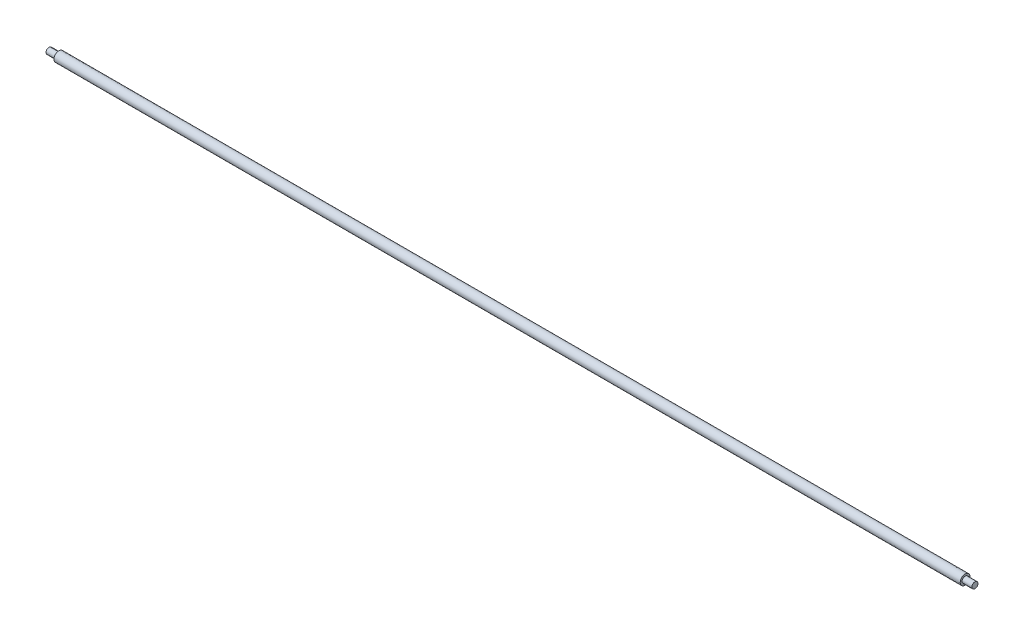
ISO-10303-21;
HEADER;
FILE_DESCRIPTION(('STEP AP214'),'2;1');
FILE_NAME('part.step','',(''),(''),'','','');
FILE_SCHEMA(('AUTOMOTIVE_DESIGN { 1 0 10303 214 1 1 1 1 }'));
ENDSEC;
DATA;
#1=APPLICATION_CONTEXT('core data for automotive mechanical design processes');
#2=APPLICATION_PROTOCOL_DEFINITION('international standard','automotive_design',2000,#1);
#3=PRODUCT_CONTEXT('',#1,'mechanical');
#4=PRODUCT('Part','Part','',(#3));
#5=PRODUCT_RELATED_PRODUCT_CATEGORY('part','',(#4));
#6=PRODUCT_DEFINITION_FORMATION('','',#4);
#7=PRODUCT_DEFINITION_CONTEXT('part definition',#1,'design');
#8=PRODUCT_DEFINITION('design','',#6,#7);
#9=PRODUCT_DEFINITION_SHAPE('','',#8);
#10=(LENGTH_UNIT() NAMED_UNIT(*) SI_UNIT(.MILLI.,.METRE.));
#11=(NAMED_UNIT(*) PLANE_ANGLE_UNIT() SI_UNIT($,.RADIAN.));
#12=(NAMED_UNIT(*) SI_UNIT($,.STERADIAN.) SOLID_ANGLE_UNIT());
#13=UNCERTAINTY_MEASURE_WITH_UNIT(LENGTH_MEASURE(1.E-05),#10,'distance_accuracy_value','');
#14=(GEOMETRIC_REPRESENTATION_CONTEXT(3) GLOBAL_UNCERTAINTY_ASSIGNED_CONTEXT((#13)) GLOBAL_UNIT_ASSIGNED_CONTEXT((#10,
#11,#12)) REPRESENTATION_CONTEXT('',''));
#15=CARTESIAN_POINT('',(0.,0.,0.));
#16=DIRECTION('',(0.,0.,1.));
#17=DIRECTION('',(1.,0.,0.));
#18=AXIS2_PLACEMENT_3D('',#15,#16,#17);
#19=CARTESIAN_POINT('',(155.702,0.,0.));
#20=DIRECTION('',(-1.,0.,0.));
#21=DIRECTION('',(0.,0.,1.));
#22=AXIS2_PLACEMENT_3D('',#19,#20,#21);
#23=CYLINDRICAL_SURFACE('',#22,1.02616);
#24=CARTESIAN_POINT('',(155.702,0.,0.));
#25=DIRECTION('',(1.,0.,0.));
#26=DIRECTION('',(0.,0.,-1.));
#27=AXIS2_PLACEMENT_3D('',#24,#25,#26);
#28=CIRCLE('',#27,1.02616);
#29=CARTESIAN_POINT('',(155.702,0.,-1.02616));
#30=VERTEX_POINT('',#29);
#31=EDGE_CURVE('E11',#30,#30,#28,.T.);
#32=ORIENTED_EDGE('',*,*,#31,.F.);
#33=EDGE_LOOP('',(#32));
#34=FACE_BOUND('',#33,.T.);
#35=CARTESIAN_POINT('',(-155.702,0.,0.));
#36=DIRECTION('',(1.,0.,0.));
#37=DIRECTION('',(0.,0.,-1.));
#38=AXIS2_PLACEMENT_3D('',#35,#36,#37);
#39=CIRCLE('',#38,1.02616);
#40=CARTESIAN_POINT('',(-155.702,0.,-1.02616));
#41=VERTEX_POINT('',#40);
#42=EDGE_CURVE('E46',#41,#41,#39,.T.);
#43=ORIENTED_EDGE('',*,*,#42,.T.);
#44=EDGE_LOOP('',(#43));
#45=FACE_BOUND('',#44,.T.);
#46=ADVANCED_FACE('F40',(#34,#45),#23,.T.);
#47=CARTESIAN_POINT('',(155.702,0.,0.));
#48=DIRECTION('',(1.,0.,0.));
#49=DIRECTION('',(0.,0.,-1.));
#50=AXIS2_PLACEMENT_3D('',#47,#48,#49);
#51=PLANE('',#50);
#52=ORIENTED_EDGE('',*,*,#31,.T.);
#53=EDGE_LOOP('',(#52));
#54=FACE_BOUND('',#53,.T.);
#55=ADVANCED_FACE('F55',(#54),#51,.T.);
#56=CARTESIAN_POINT('',(-155.702,0.,0.));
#57=DIRECTION('',(1.,0.,0.));
#58=DIRECTION('',(0.,0.,-1.));
#59=AXIS2_PLACEMENT_3D('',#56,#57,#58);
#60=PLANE('',#59);
#61=ORIENTED_EDGE('',*,*,#42,.F.);
#62=EDGE_LOOP('',(#61));
#63=FACE_BOUND('',#62,.T.);
#64=ADVANCED_FACE('F53',(#63),#60,.F.);
#65=CLOSED_SHELL('',(#46,#55,#64));
#66=MANIFOLD_SOLID_BREP('B2',#65);
#67=CARTESIAN_POINT('',(-152.4,0.,0.));
#68=DIRECTION('',(1.,0.,0.));
#69=DIRECTION('',(0.,0.,-1.));
#70=AXIS2_PLACEMENT_3D('',#67,#68,#69);
#71=CYLINDRICAL_SURFACE('',#70,1.651);
#72=CARTESIAN_POINT('',(-152.4,0.,0.));
#73=DIRECTION('',(1.,0.,0.));
#74=DIRECTION('',(0.,0.,-1.));
#75=AXIS2_PLACEMENT_3D('',#72,#73,#74);
#76=CIRCLE('',#75,1.651);
#77=CARTESIAN_POINT('',(-152.4,0.,-1.651));
#78=VERTEX_POINT('',#77);
#79=EDGE_CURVE('E39',#78,#78,#76,.T.);
#80=CARTESIAN_POINT('',(152.4,0.,0.));
#81=DIRECTION('',(1.,0.,0.));
#82=DIRECTION('',(0.,0.,-1.));
#83=AXIS2_PLACEMENT_3D('',#80,#81,#82);
#84=CIRCLE('',#83,1.651);
#85=CARTESIAN_POINT('',(152.4,0.,-1.651));
#86=VERTEX_POINT('',#85);
#87=EDGE_CURVE('E83',#86,#86,#84,.T.);
#88=CARTESIAN_POINT('',(-152.4,0.,-1.651));
#89=CARTESIAN_POINT('',(-149.225,0.,-1.651));
#90=CARTESIAN_POINT('',(-146.05,0.,-1.651));
#91=CARTESIAN_POINT('',(-139.7,0.,-1.651));
#92=CARTESIAN_POINT('',(-136.525,0.,-1.651));
#93=CARTESIAN_POINT('',(-130.175,0.,-1.651));
#94=CARTESIAN_POINT('',(-127.,0.,-1.651));
#95=CARTESIAN_POINT('',(-120.65,0.,-1.651));
#96=CARTESIAN_POINT('',(-117.475,0.,-1.651));
#97=CARTESIAN_POINT('',(-111.125,0.,-1.651));
#98=CARTESIAN_POINT('',(-107.95,0.,-1.651));
#99=CARTESIAN_POINT('',(-101.6,0.,-1.651));
#100=CARTESIAN_POINT('',(-98.425,0.,-1.651));
#101=CARTESIAN_POINT('',(-92.075,0.,-1.651));
#102=CARTESIAN_POINT('',(-88.9,0.,-1.651));
#103=CARTESIAN_POINT('',(-82.55,0.,-1.651));
#104=CARTESIAN_POINT('',(-79.375,0.,-1.651));
#105=CARTESIAN_POINT('',(-73.025,0.,-1.651));
#106=CARTESIAN_POINT('',(-69.85,0.,-1.651));
#107=CARTESIAN_POINT('',(-63.5,0.,-1.651));
#108=CARTESIAN_POINT('',(-60.325,0.,-1.651));
#109=CARTESIAN_POINT('',(-53.975,0.,-1.651));
#110=CARTESIAN_POINT('',(-50.8,0.,-1.651));
#111=CARTESIAN_POINT('',(-44.45,0.,-1.651));
#112=CARTESIAN_POINT('',(-41.275,0.,-1.651));
#113=CARTESIAN_POINT('',(-34.925,0.,-1.651));
#114=CARTESIAN_POINT('',(-31.75,0.,-1.651));
#115=CARTESIAN_POINT('',(-25.4,0.,-1.651));
#116=CARTESIAN_POINT('',(-22.225,0.,-1.651));
#117=CARTESIAN_POINT('',(-15.875,0.,-1.651));
#118=CARTESIAN_POINT('',(-12.7,0.,-1.651));
#119=CARTESIAN_POINT('',(-6.35,0.,-1.651));
#120=CARTESIAN_POINT('',(-3.175,0.,-1.651));
#121=CARTESIAN_POINT('',(3.175,0.,-1.651));
#122=CARTESIAN_POINT('',(6.35,0.,-1.651));
#123=CARTESIAN_POINT('',(12.7,0.,-1.651));
#124=CARTESIAN_POINT('',(15.875,0.,-1.651));
#125=CARTESIAN_POINT('',(22.225,0.,-1.651));
#126=CARTESIAN_POINT('',(25.4,0.,-1.651));
#127=CARTESIAN_POINT('',(31.75,0.,-1.651));
#128=CARTESIAN_POINT('',(34.925,0.,-1.651));
#129=CARTESIAN_POINT('',(41.275,0.,-1.651));
#130=CARTESIAN_POINT('',(44.45,0.,-1.651));
#131=CARTESIAN_POINT('',(50.8,0.,-1.651));
#132=CARTESIAN_POINT('',(53.975,0.,-1.651));
#133=CARTESIAN_POINT('',(60.325,0.,-1.651));
#134=CARTESIAN_POINT('',(63.5,0.,-1.651));
#135=CARTESIAN_POINT('',(69.85,0.,-1.651));
#136=CARTESIAN_POINT('',(73.025,0.,-1.651));
#137=CARTESIAN_POINT('',(79.375,0.,-1.651));
#138=CARTESIAN_POINT('',(82.55,0.,-1.651));
#139=CARTESIAN_POINT('',(88.9,0.,-1.651));
#140=CARTESIAN_POINT('',(92.075,0.,-1.651));
#141=CARTESIAN_POINT('',(98.425,0.,-1.651));
#142=CARTESIAN_POINT('',(101.6,0.,-1.651));
#143=CARTESIAN_POINT('',(107.95,0.,-1.651));
#144=CARTESIAN_POINT('',(111.125,0.,-1.651));
#145=CARTESIAN_POINT('',(117.475,0.,-1.651));
#146=CARTESIAN_POINT('',(120.65,0.,-1.651));
#147=CARTESIAN_POINT('',(127.,0.,-1.651));
#148=CARTESIAN_POINT('',(130.175,0.,-1.651));
#149=CARTESIAN_POINT('',(136.525,0.,-1.651));
#150=CARTESIAN_POINT('',(139.7,0.,-1.651));
#151=CARTESIAN_POINT('',(146.05,0.,-1.651));
#152=CARTESIAN_POINT('',(149.225,0.,-1.651));
#153=CARTESIAN_POINT('',(152.4,0.,-1.651));
#154=B_SPLINE_CURVE_WITH_KNOTS('',3,(#88,#89,#90,#91,#92,#93,#94,#95,#96,#97,#98,#99,#100,#101,
#102,#103,#104,#105,#106,#107,#108,#109,#110,#111,#112,#113,#114,#115,#116,#117,#118,#119,#120,
#121,#122,#123,#124,#125,#126,#127,#128,#129,#130,#131,#132,#133,#134,#135,#136,#137,#138,#139,
#140,#141,#142,#143,#144,#145,#146,#147,#148,#149,#150,#151,#152,#153),.UNSPECIFIED.,.F.,.F.,(4,
2,2,2,2,2,2,2,2,2,2,2,2,2,2,2,2,2,2,2,2,2,2,2,2,2,2,2,2,2,2,2,4),(0.,9.52499999999998,19.05,
28.575,38.1,47.625,57.15,66.675,76.2,85.725,95.25,104.775,114.3,123.825,133.35,142.875,152.4,
161.925,171.45,180.975,190.5,200.025,209.55,219.075,228.6,238.125,247.65,257.175,266.7,276.225,
285.75,295.275,304.8),.UNSPECIFIED.);
#155=EDGE_CURVE('BSEAM80',#78,#86,#154,.T.);
#156=ORIENTED_EDGE('',*,*,#79,.T.);
#157=ORIENTED_EDGE('',*,*,#87,.F.);
#158=ORIENTED_EDGE('',*,*,#155,.T.);
#159=ORIENTED_EDGE('',*,*,#155,.F.);
#160=EDGE_LOOP('',(#156,#158,#157,#159));
#161=FACE_BOUND('',#160,.T.);
#162=ADVANCED_FACE('F80',(#161),#71,.T.);
#163=CARTESIAN_POINT('',(-152.4,0.,0.));
#164=DIRECTION('',(1.,0.,0.));
#165=DIRECTION('',(0.,0.,-1.));
#166=AXIS2_PLACEMENT_3D('',#163,#164,#165);
#167=PLANE('',#166);
#168=CARTESIAN_POINT('',(-152.4,0.,0.));
#169=DIRECTION('',(1.,0.,0.));
#170=DIRECTION('',(0.,0.,-1.));
#171=AXIS2_PLACEMENT_3D('',#168,#169,#170);
#172=CIRCLE('',#171,1.03124);
#173=CARTESIAN_POINT('',(-152.4,0.,-1.03124));
#174=VERTEX_POINT('',#173);
#175=EDGE_CURVE('E90',#174,#174,#172,.T.);
#176=ORIENTED_EDGE('',*,*,#175,.T.);
#177=EDGE_LOOP('',(#176));
#178=FACE_BOUND('',#177,.T.);
#179=ORIENTED_EDGE('',*,*,#79,.F.);
#180=EDGE_LOOP('',(#179));
#181=FACE_BOUND('',#180,.T.);
#182=ADVANCED_FACE('F104',(#178,#181),#167,.F.);
#183=CARTESIAN_POINT('',(152.4,0.,0.));
#184=DIRECTION('',(1.,0.,0.));
#185=DIRECTION('',(0.,0.,-1.));
#186=AXIS2_PLACEMENT_3D('',#183,#184,#185);
#187=PLANE('',#186);
#188=CARTESIAN_POINT('',(152.4,0.,0.));
#189=DIRECTION('',(1.,0.,0.));
#190=DIRECTION('',(0.,0.,-1.));
#191=AXIS2_PLACEMENT_3D('',#188,#189,#190);
#192=CIRCLE('',#191,1.03124);
#193=CARTESIAN_POINT('',(152.4,0.,-1.03124));
#194=VERTEX_POINT('',#193);
#195=EDGE_CURVE('E94',#194,#194,#192,.T.);
#196=ORIENTED_EDGE('',*,*,#195,.F.);
#197=EDGE_LOOP('',(#196));
#198=FACE_BOUND('',#197,.T.);
#199=ORIENTED_EDGE('',*,*,#87,.T.);
#200=EDGE_LOOP('',(#199));
#201=FACE_BOUND('',#200,.T.);
#202=ADVANCED_FACE('F101',(#198,#201),#187,.T.);
#203=CARTESIAN_POINT('',(-155.702,0.,0.));
#204=DIRECTION('',(1.,0.,0.));
#205=DIRECTION('',(0.,0.,-1.));
#206=AXIS2_PLACEMENT_3D('',#203,#204,#205);
#207=CYLINDRICAL_SURFACE('',#206,1.03124);
#208=ORIENTED_EDGE('',*,*,#195,.T.);
#209=EDGE_LOOP('',(#208));
#210=FACE_BOUND('',#209,.T.);
#211=ORIENTED_EDGE('',*,*,#175,.F.);
#212=EDGE_LOOP('',(#211));
#213=FACE_BOUND('',#212,.T.);
#214=ADVANCED_FACE('F98',(#210,#213),#207,.F.);
#215=CLOSED_SHELL('',(#162,#182,#202,#214));
#216=MANIFOLD_SOLID_BREP('B6',#215);
#217=ADVANCED_BREP_SHAPE_REPRESENTATION('',(#18,#66,#216),#14);
#218=SHAPE_DEFINITION_REPRESENTATION(#9,#217);
ENDSEC;
END-ISO-10303-21;
